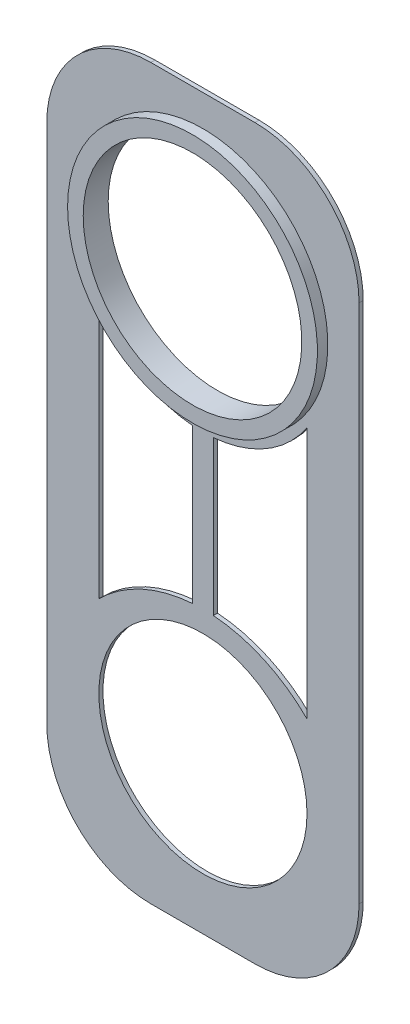
ISO-10303-21;
HEADER;
FILE_DESCRIPTION(('STEP AP214'),'2;1');
FILE_NAME('part.step','',(''),(''),'','','');
FILE_SCHEMA(('AUTOMOTIVE_DESIGN { 1 0 10303 214 1 1 1 1 }'));
ENDSEC;
DATA;
#1=APPLICATION_CONTEXT('core data for automotive mechanical design processes');
#2=APPLICATION_PROTOCOL_DEFINITION('international standard','automotive_design',2000,#1);
#3=PRODUCT_CONTEXT('',#1,'mechanical');
#4=PRODUCT('Part','Part','',(#3));
#5=PRODUCT_RELATED_PRODUCT_CATEGORY('part','',(#4));
#6=PRODUCT_DEFINITION_FORMATION('','',#4);
#7=PRODUCT_DEFINITION_CONTEXT('part definition',#1,'design');
#8=PRODUCT_DEFINITION('design','',#6,#7);
#9=PRODUCT_DEFINITION_SHAPE('','',#8);
#10=(LENGTH_UNIT() NAMED_UNIT(*) SI_UNIT(.MILLI.,.METRE.));
#11=(NAMED_UNIT(*) PLANE_ANGLE_UNIT() SI_UNIT($,.RADIAN.));
#12=(NAMED_UNIT(*) SI_UNIT($,.STERADIAN.) SOLID_ANGLE_UNIT());
#13=UNCERTAINTY_MEASURE_WITH_UNIT(LENGTH_MEASURE(1.E-05),#10,'distance_accuracy_value','');
#14=(GEOMETRIC_REPRESENTATION_CONTEXT(3) GLOBAL_UNCERTAINTY_ASSIGNED_CONTEXT((#13)) GLOBAL_UNIT_ASSIGNED_CONTEXT((#10,
#11,#12)) REPRESENTATION_CONTEXT('',''));
#15=CARTESIAN_POINT('',(0.,0.,0.));
#16=DIRECTION('',(0.,0.,1.));
#17=DIRECTION('',(1.,0.,0.));
#18=AXIS2_PLACEMENT_3D('',#15,#16,#17);
#19=CARTESIAN_POINT('',(19.05,16.3589354542511,1.778));
#20=DIRECTION('',(0.,0.,-1.));
#21=DIRECTION('',(-1.,0.,0.));
#22=AXIS2_PLACEMENT_3D('',#19,#20,#21);
#23=CYLINDRICAL_SURFACE('',#22,17.9605122421383);
#24=CARTESIAN_POINT('',(19.05,16.3589354542511,0.508));
#25=DIRECTION('',(0.,0.,1.));
#26=DIRECTION('',(1.,0.,0.));
#27=AXIS2_PLACEMENT_3D('',#24,#25,#26);
#28=CIRCLE('',#27,17.9605122421383);
#29=CARTESIAN_POINT('',(6.35,29.0589354542512,0.508));
#30=VERTEX_POINT('',#29);
#31=CARTESIAN_POINT('',(17.78,34.2744901484268,0.508));
#32=VERTEX_POINT('',#31);
#33=EDGE_CURVE('E224',#30,#32,#28,.F.);
#34=ORIENTED_EDGE('',*,*,#33,.T.);
#35=DIRECTION('',(0.,0.,-1.));
#36=VECTOR('',#35,1.);
#37=CARTESIAN_POINT('',(17.78,34.2744901484268,1.778));
#38=LINE('',#37,#36);
#39=CARTESIAN_POINT('',(17.78,34.2744901484268,0.));
#40=VERTEX_POINT('',#39);
#41=EDGE_CURVE('E162',#32,#40,#38,.T.);
#42=ORIENTED_EDGE('',*,*,#41,.T.);
#43=CARTESIAN_POINT('',(19.05,16.3589354542511,0.));
#44=DIRECTION('',(0.,0.,1.));
#45=DIRECTION('',(1.,0.,0.));
#46=AXIS2_PLACEMENT_3D('',#43,#44,#45);
#47=CIRCLE('',#46,17.9605122421383);
#48=CARTESIAN_POINT('',(6.35,29.0589354542512,0.));
#49=VERTEX_POINT('',#48);
#50=EDGE_CURVE('E181',#40,#49,#47,.T.);
#51=ORIENTED_EDGE('',*,*,#50,.T.);
#52=DIRECTION('',(0.,0.,-1.));
#53=VECTOR('',#52,1.);
#54=CARTESIAN_POINT('',(6.35,29.0589354542512,1.778));
#55=LINE('',#54,#53);
#56=EDGE_CURVE('E196',#30,#49,#55,.T.);
#57=ORIENTED_EDGE('',*,*,#56,.F.);
#58=EDGE_LOOP('',(#34,#42,#51,#57));
#59=FACE_BOUND('',#58,.T.);
#60=ADVANCED_FACE('F50',(#59),#23,.T.);
#61=CARTESIAN_POINT('',(19.05,68.2652915132516,1.778));
#62=DIRECTION('',(0.,0.,-1.));
#63=DIRECTION('',(-1.,0.,0.));
#64=AXIS2_PLACEMENT_3D('',#61,#62,#63);
#65=CYLINDRICAL_SURFACE('',#64,15.24);
#66=CARTESIAN_POINT('',(19.05,68.2652915132516,0.));
#67=DIRECTION('',(0.,0.,1.));
#68=DIRECTION('',(-1.,0.,0.));
#69=AXIS2_PLACEMENT_3D('',#66,#67,#68);
#70=CIRCLE('',#69,15.24);
#71=CARTESIAN_POINT('',(6.35000000000001,59.8410645457488,0.));
#72=VERTEX_POINT('',#71);
#73=CARTESIAN_POINT('',(17.78,53.0783003695128,0.));
#74=VERTEX_POINT('',#73);
#75=EDGE_CURVE('E193',#72,#74,#70,.T.);
#76=ORIENTED_EDGE('',*,*,#75,.T.);
#77=DIRECTION('',(0.,0.,-1.));
#78=VECTOR('',#77,1.);
#79=CARTESIAN_POINT('',(17.78,53.0783003695128,1.778));
#80=LINE('',#79,#78);
#81=CARTESIAN_POINT('',(17.78,53.0783003695128,0.508));
#82=VERTEX_POINT('',#81);
#83=EDGE_CURVE('E11',#74,#82,#80,.F.);
#84=ORIENTED_EDGE('',*,*,#83,.T.);
#85=CARTESIAN_POINT('',(19.05,68.2652915132516,0.508));
#86=DIRECTION('',(0.,0.,1.));
#87=DIRECTION('',(1.,0.,0.));
#88=AXIS2_PLACEMENT_3D('',#85,#86,#87);
#89=CIRCLE('',#88,15.24);
#90=CARTESIAN_POINT('',(6.35000000000001,59.8410645457488,0.508));
#91=VERTEX_POINT('',#90);
#92=EDGE_CURVE('E212',#82,#91,#89,.F.);
#93=ORIENTED_EDGE('',*,*,#92,.T.);
#94=DIRECTION('',(0.,0.,-1.));
#95=VECTOR('',#94,1.);
#96=CARTESIAN_POINT('',(6.35000000000001,59.8410645457488,1.778));
#97=LINE('',#96,#95);
#98=EDGE_CURVE('E206',#91,#72,#97,.T.);
#99=ORIENTED_EDGE('',*,*,#98,.T.);
#100=EDGE_LOOP('',(#76,#84,#93,#99));
#101=FACE_BOUND('',#100,.T.);
#102=ADVANCED_FACE('F361',(#101),#65,.T.);
#103=CARTESIAN_POINT('',(12.7,12.7,0.508));
#104=DIRECTION('',(0.,0.,1.));
#105=DIRECTION('',(1.,0.,0.));
#106=AXIS2_PLACEMENT_3D('',#103,#104,#105);
#107=PLANE('',#106);
#108=CARTESIAN_POINT('',(20.32,34.2744901484268,0.508));
#109=VERTEX_POINT('',#108);
#110=CARTESIAN_POINT('',(31.75,29.0589354542512,0.508));
#111=VERTEX_POINT('',#110);
#112=EDGE_CURVE('E225',#109,#111,#28,.F.);
#113=ORIENTED_EDGE('',*,*,#112,.F.);
#114=DIRECTION('',(0.,-1.,0.));
#115=VECTOR('',#114,1.);
#116=CARTESIAN_POINT('',(20.32,53.1718668378781,0.508));
#117=LINE('',#116,#115);
#118=CARTESIAN_POINT('',(20.32,53.0783003695128,0.508));
#119=VERTEX_POINT('',#118);
#120=EDGE_CURVE('E64',#119,#109,#117,.T.);
#121=ORIENTED_EDGE('',*,*,#120,.F.);
#122=CARTESIAN_POINT('',(31.75,59.8410645457488,0.508));
#123=VERTEX_POINT('',#122);
#124=EDGE_CURVE('E214',#123,#119,#89,.F.);
#125=ORIENTED_EDGE('',*,*,#124,.F.);
#126=DIRECTION('',(0.,1.,0.));
#127=VECTOR('',#126,1.);
#128=CARTESIAN_POINT('',(31.75,12.7,0.508));
#129=LINE('',#128,#127);
#130=EDGE_CURVE('E218',#111,#123,#129,.T.);
#131=ORIENTED_EDGE('',*,*,#130,.F.);
#132=EDGE_LOOP('',(#113,#121,#125,#131));
#133=FACE_BOUND('',#132,.T.);
#134=ORIENTED_EDGE('',*,*,#92,.F.);
#135=DIRECTION('',(0.,1.,0.));
#136=VECTOR('',#135,1.);
#137=CARTESIAN_POINT('',(17.78,34.1626918663108,0.508));
#138=LINE('',#137,#136);
#139=EDGE_CURVE('E163',#32,#82,#138,.T.);
#140=ORIENTED_EDGE('',*,*,#139,.F.);
#141=ORIENTED_EDGE('',*,*,#33,.F.);
#142=DIRECTION('',(0.,-1.,0.));
#143=VECTOR('',#142,1.);
#144=CARTESIAN_POINT('',(6.35,12.7,0.508));
#145=LINE('',#144,#143);
#146=EDGE_CURVE('E203',#91,#30,#145,.T.);
#147=ORIENTED_EDGE('',*,*,#146,.F.);
#148=EDGE_LOOP('',(#134,#140,#141,#147));
#149=FACE_BOUND('',#148,.T.);
#150=CARTESIAN_POINT('',(19.05,69.85,0.508));
#151=DIRECTION('',(0.,0.,-1.));
#152=DIRECTION('',(-1.,0.,0.));
#153=AXIS2_PLACEMENT_3D('',#150,#151,#152);
#154=CIRCLE('',#153,15.24);
#155=CARTESIAN_POINT('',(3.81000000000001,69.85,0.508));
#156=VERTEX_POINT('',#155);
#157=EDGE_CURVE('E233',#156,#156,#154,.T.);
#158=ORIENTED_EDGE('',*,*,#157,.T.);
#159=EDGE_LOOP('',(#158));
#160=FACE_BOUND('',#159,.T.);
#161=CARTESIAN_POINT('',(12.7,12.7,0.508));
#162=DIRECTION('',(0.,0.,1.));
#163=DIRECTION('',(1.,0.,0.));
#164=AXIS2_PLACEMENT_3D('',#161,#162,#163);
#165=CIRCLE('',#164,12.7);
#166=CARTESIAN_POINT('',(0.,12.7000000000001,0.508));
#167=VERTEX_POINT('',#166);
#168=CARTESIAN_POINT('',(12.7000000000001,0.,0.508));
#169=VERTEX_POINT('',#168);
#170=EDGE_CURVE('E261',#167,#169,#165,.T.);
#171=ORIENTED_EDGE('',*,*,#170,.T.);
#172=DIRECTION('',(1.,0.,0.));
#173=VECTOR('',#172,1.);
#174=CARTESIAN_POINT('',(12.7000000000001,0.,0.508));
#175=LINE('',#174,#173);
#176=CARTESIAN_POINT('',(25.3999999999999,0.,0.508));
#177=VERTEX_POINT('',#176);
#178=EDGE_CURVE('E264',#169,#177,#175,.T.);
#179=ORIENTED_EDGE('',*,*,#178,.T.);
#180=CARTESIAN_POINT('',(25.4,12.7,0.508));
#181=DIRECTION('',(0.,0.,1.));
#182=DIRECTION('',(1.,0.,0.));
#183=AXIS2_PLACEMENT_3D('',#180,#181,#182);
#184=CIRCLE('',#183,12.7);
#185=CARTESIAN_POINT('',(38.1,12.7000000000001,0.508));
#186=VERTEX_POINT('',#185);
#187=EDGE_CURVE('E267',#177,#186,#184,.T.);
#188=ORIENTED_EDGE('',*,*,#187,.T.);
#189=DIRECTION('',(0.,1.,0.));
#190=VECTOR('',#189,1.);
#191=CARTESIAN_POINT('',(38.1,12.7000000000001,0.508));
#192=LINE('',#191,#190);
#193=CARTESIAN_POINT('',(38.1,76.1999999999999,0.508));
#194=VERTEX_POINT('',#193);
#195=EDGE_CURVE('E275',#186,#194,#192,.T.);
#196=ORIENTED_EDGE('',*,*,#195,.T.);
#197=CARTESIAN_POINT('',(25.4,76.2,0.508));
#198=DIRECTION('',(0.,0.,1.));
#199=DIRECTION('',(1.,0.,0.));
#200=AXIS2_PLACEMENT_3D('',#197,#198,#199);
#201=CIRCLE('',#200,12.7);
#202=CARTESIAN_POINT('',(25.3999999999999,88.9,0.508));
#203=VERTEX_POINT('',#202);
#204=EDGE_CURVE('E274',#194,#203,#201,.T.);
#205=ORIENTED_EDGE('',*,*,#204,.T.);
#206=DIRECTION('',(-1.,0.,0.));
#207=VECTOR('',#206,1.);
#208=CARTESIAN_POINT('',(12.7000000000001,88.9,0.508));
#209=LINE('',#208,#207);
#210=CARTESIAN_POINT('',(12.7000000000001,88.9,0.508));
#211=VERTEX_POINT('',#210);
#212=EDGE_CURVE('E279',#203,#211,#209,.T.);
#213=ORIENTED_EDGE('',*,*,#212,.T.);
#214=CARTESIAN_POINT('',(12.7,76.2,0.508));
#215=DIRECTION('',(0.,0.,1.));
#216=DIRECTION('',(1.,0.,0.));
#217=AXIS2_PLACEMENT_3D('',#214,#215,#216);
#218=CIRCLE('',#217,12.7);
#219=CARTESIAN_POINT('',(0.,76.1999999999999,0.508));
#220=VERTEX_POINT('',#219);
#221=EDGE_CURVE('E282',#211,#220,#218,.T.);
#222=ORIENTED_EDGE('',*,*,#221,.T.);
#223=DIRECTION('',(0.,-1.,0.));
#224=VECTOR('',#223,1.);
#225=CARTESIAN_POINT('',(0.,12.7000000000001,0.508));
#226=LINE('',#225,#224);
#227=EDGE_CURVE('E281',#220,#167,#226,.T.);
#228=ORIENTED_EDGE('',*,*,#227,.T.);
#229=EDGE_LOOP('',(#171,#179,#188,#196,#205,#213,#222,#228));
#230=FACE_BOUND('',#229,.T.);
#231=CARTESIAN_POINT('',(19.05,19.05,0.508));
#232=DIRECTION('',(0.,0.,1.));
#233=DIRECTION('',(1.,0.,0.));
#234=AXIS2_PLACEMENT_3D('',#231,#232,#233);
#235=CIRCLE('',#234,12.7);
#236=CARTESIAN_POINT('',(31.75,19.05,0.508));
#237=VERTEX_POINT('',#236);
#238=EDGE_CURVE('E251',#237,#237,#235,.T.);
#239=ORIENTED_EDGE('',*,*,#238,.F.);
#240=EDGE_LOOP('',(#239));
#241=FACE_BOUND('',#240,.T.);
#242=ADVANCED_FACE('F347',(#133,#149,#160,#230,#241),#107,.T.);
#243=CARTESIAN_POINT('',(12.7,12.7,0.));
#244=DIRECTION('',(0.,0.,1.));
#245=DIRECTION('',(1.,0.,0.));
#246=AXIS2_PLACEMENT_3D('',#243,#244,#245);
#247=PLANE('',#246);
#248=ORIENTED_EDGE('',*,*,#50,.F.);
#249=DIRECTION('',(0.,1.,0.));
#250=VECTOR('',#249,1.);
#251=CARTESIAN_POINT('',(17.78,53.0252915132516,0.));
#252=LINE('',#251,#250);
#253=EDGE_CURVE('E173',#40,#74,#252,.T.);
#254=ORIENTED_EDGE('',*,*,#253,.T.);
#255=ORIENTED_EDGE('',*,*,#75,.F.);
#256=DIRECTION('',(0.,1.,0.));
#257=VECTOR('',#256,1.);
#258=CARTESIAN_POINT('',(6.35000000000001,59.8410645457488,0.));
#259=LINE('',#258,#257);
#260=EDGE_CURVE('E185',#49,#72,#259,.T.);
#261=ORIENTED_EDGE('',*,*,#260,.F.);
#262=EDGE_LOOP('',(#248,#254,#255,#261));
#263=FACE_BOUND('',#262,.T.);
#264=CARTESIAN_POINT('',(20.32,53.0783003695128,0.));
#265=VERTEX_POINT('',#264);
#266=CARTESIAN_POINT('',(31.75,59.8410645457488,0.));
#267=VERTEX_POINT('',#266);
#268=EDGE_CURVE('E174',#265,#267,#70,.T.);
#269=ORIENTED_EDGE('',*,*,#268,.F.);
#270=DIRECTION('',(0.,-1.,0.));
#271=VECTOR('',#270,1.);
#272=CARTESIAN_POINT('',(20.32,34.3194476963894,0.));
#273=LINE('',#272,#271);
#274=CARTESIAN_POINT('',(20.32,34.2744901484268,0.));
#275=VERTEX_POINT('',#274);
#276=EDGE_CURVE('E66',#265,#275,#273,.T.);
#277=ORIENTED_EDGE('',*,*,#276,.T.);
#278=CARTESIAN_POINT('',(31.75,29.0589354542512,0.));
#279=VERTEX_POINT('',#278);
#280=EDGE_CURVE('E175',#279,#275,#47,.T.);
#281=ORIENTED_EDGE('',*,*,#280,.F.);
#282=DIRECTION('',(0.,-1.,0.));
#283=VECTOR('',#282,1.);
#284=CARTESIAN_POINT('',(31.75,29.0589354542512,0.));
#285=LINE('',#284,#283);
#286=EDGE_CURVE('E194',#267,#279,#285,.T.);
#287=ORIENTED_EDGE('',*,*,#286,.F.);
#288=EDGE_LOOP('',(#269,#277,#281,#287));
#289=FACE_BOUND('',#288,.T.);
#290=CARTESIAN_POINT('',(19.05,69.85,0.));
#291=DIRECTION('',(0.,0.,-1.));
#292=DIRECTION('',(-1.,0.,0.));
#293=AXIS2_PLACEMENT_3D('',#290,#291,#292);
#294=CIRCLE('',#293,15.24);
#295=CARTESIAN_POINT('',(3.81000000000001,69.85,0.));
#296=VERTEX_POINT('',#295);
#297=EDGE_CURVE('E246',#296,#296,#294,.T.);
#298=ORIENTED_EDGE('',*,*,#297,.F.);
#299=EDGE_LOOP('',(#298));
#300=FACE_BOUND('',#299,.T.);
#301=CARTESIAN_POINT('',(12.7,12.7,0.));
#302=DIRECTION('',(0.,0.,1.));
#303=DIRECTION('',(1.,0.,0.));
#304=AXIS2_PLACEMENT_3D('',#301,#302,#303);
#305=CIRCLE('',#304,12.7);
#306=CARTESIAN_POINT('',(0.,12.7000000000001,0.));
#307=VERTEX_POINT('',#306);
#308=CARTESIAN_POINT('',(12.7000000000001,0.,0.));
#309=VERTEX_POINT('',#308);
#310=EDGE_CURVE('E260',#307,#309,#305,.T.);
#311=ORIENTED_EDGE('',*,*,#310,.F.);
#312=DIRECTION('',(0.,-1.,0.));
#313=VECTOR('',#312,1.);
#314=CARTESIAN_POINT('',(0.,12.7000000000001,0.));
#315=LINE('',#314,#313);
#316=CARTESIAN_POINT('',(0.,76.1999999999999,0.));
#317=VERTEX_POINT('',#316);
#318=EDGE_CURVE('E266',#317,#307,#315,.T.);
#319=ORIENTED_EDGE('',*,*,#318,.F.);
#320=CARTESIAN_POINT('',(12.7,76.2,0.));
#321=DIRECTION('',(0.,0.,1.));
#322=DIRECTION('',(1.,0.,0.));
#323=AXIS2_PLACEMENT_3D('',#320,#321,#322);
#324=CIRCLE('',#323,12.7);
#325=CARTESIAN_POINT('',(12.7000000000001,88.9,0.));
#326=VERTEX_POINT('',#325);
#327=EDGE_CURVE('E308',#326,#317,#324,.T.);
#328=ORIENTED_EDGE('',*,*,#327,.F.);
#329=DIRECTION('',(-1.,0.,0.));
#330=VECTOR('',#329,1.);
#331=CARTESIAN_POINT('',(12.7000000000001,88.9,0.));
#332=LINE('',#331,#330);
#333=CARTESIAN_POINT('',(25.3999999999999,88.9,0.));
#334=VERTEX_POINT('',#333);
#335=EDGE_CURVE('E301',#334,#326,#332,.T.);
#336=ORIENTED_EDGE('',*,*,#335,.F.);
#337=CARTESIAN_POINT('',(25.4,76.2,0.));
#338=DIRECTION('',(0.,0.,1.));
#339=DIRECTION('',(1.,0.,0.));
#340=AXIS2_PLACEMENT_3D('',#337,#338,#339);
#341=CIRCLE('',#340,12.7);
#342=CARTESIAN_POINT('',(38.1,76.1999999999999,0.));
#343=VERTEX_POINT('',#342);
#344=EDGE_CURVE('E298',#343,#334,#341,.T.);
#345=ORIENTED_EDGE('',*,*,#344,.F.);
#346=DIRECTION('',(0.,1.,0.));
#347=VECTOR('',#346,1.);
#348=CARTESIAN_POINT('',(38.1,12.7000000000001,0.));
#349=LINE('',#348,#347);
#350=CARTESIAN_POINT('',(38.1,12.7000000000001,0.));
#351=VERTEX_POINT('',#350);
#352=EDGE_CURVE('E300',#351,#343,#349,.T.);
#353=ORIENTED_EDGE('',*,*,#352,.F.);
#354=CARTESIAN_POINT('',(25.4,12.7,0.));
#355=DIRECTION('',(0.,0.,1.));
#356=DIRECTION('',(1.,0.,0.));
#357=AXIS2_PLACEMENT_3D('',#354,#355,#356);
#358=CIRCLE('',#357,12.7);
#359=CARTESIAN_POINT('',(25.3999999999999,0.,0.));
#360=VERTEX_POINT('',#359);
#361=EDGE_CURVE('E294',#360,#351,#358,.T.);
#362=ORIENTED_EDGE('',*,*,#361,.F.);
#363=DIRECTION('',(1.,0.,0.));
#364=VECTOR('',#363,1.);
#365=CARTESIAN_POINT('',(12.7000000000001,0.,0.));
#366=LINE('',#365,#364);
#367=EDGE_CURVE('E292',#309,#360,#366,.T.);
#368=ORIENTED_EDGE('',*,*,#367,.F.);
#369=EDGE_LOOP('',(#311,#319,#328,#336,#345,#353,#362,#368));
#370=FACE_BOUND('',#369,.T.);
#371=CARTESIAN_POINT('',(19.05,19.05,0.));
#372=DIRECTION('',(0.,0.,1.));
#373=DIRECTION('',(1.,0.,0.));
#374=AXIS2_PLACEMENT_3D('',#371,#372,#373);
#375=CIRCLE('',#374,12.7);
#376=CARTESIAN_POINT('',(31.75,19.05,0.));
#377=VERTEX_POINT('',#376);
#378=EDGE_CURVE('E250',#377,#377,#375,.T.);
#379=ORIENTED_EDGE('',*,*,#378,.T.);
#380=EDGE_LOOP('',(#379));
#381=FACE_BOUND('',#380,.T.);
#382=ADVANCED_FACE('F166',(#263,#289,#300,#370,#381),#247,.F.);
#383=CARTESIAN_POINT('',(12.7,12.7,0.508));
#384=DIRECTION('',(0.,0.,-1.));
#385=DIRECTION('',(-1.,0.,0.));
#386=AXIS2_PLACEMENT_3D('',#383,#384,#385);
#387=CYLINDRICAL_SURFACE('',#386,12.7);
#388=ORIENTED_EDGE('',*,*,#310,.T.);
#389=DIRECTION('',(0.,0.,-1.));
#390=VECTOR('',#389,1.);
#391=CARTESIAN_POINT('',(12.7000000000001,0.,0.508));
#392=LINE('',#391,#390);
#393=EDGE_CURVE('E252',#169,#309,#392,.T.);
#394=ORIENTED_EDGE('',*,*,#393,.F.);
#395=ORIENTED_EDGE('',*,*,#170,.F.);
#396=DIRECTION('',(0.,0.,-1.));
#397=VECTOR('',#396,1.);
#398=CARTESIAN_POINT('',(0.,12.7000000000001,0.508));
#399=LINE('',#398,#397);
#400=EDGE_CURVE('E290',#167,#307,#399,.T.);
#401=ORIENTED_EDGE('',*,*,#400,.T.);
#402=EDGE_LOOP('',(#388,#394,#395,#401));
#403=FACE_BOUND('',#402,.T.);
#404=ADVANCED_FACE('F47',(#403),#387,.T.);
#405=CARTESIAN_POINT('',(12.7000000000001,0.,0.508));
#406=DIRECTION('',(0.,1.,0.));
#407=DIRECTION('',(0.,0.,1.));
#408=AXIS2_PLACEMENT_3D('',#405,#406,#407);
#409=PLANE('',#408);
#410=ORIENTED_EDGE('',*,*,#367,.T.);
#411=DIRECTION('',(0.,0.,-1.));
#412=VECTOR('',#411,1.);
#413=CARTESIAN_POINT('',(25.3999999999999,0.,0.508));
#414=LINE('',#413,#412);
#415=EDGE_CURVE('E331',#177,#360,#414,.T.);
#416=ORIENTED_EDGE('',*,*,#415,.F.);
#417=ORIENTED_EDGE('',*,*,#178,.F.);
#418=ORIENTED_EDGE('',*,*,#393,.T.);
#419=EDGE_LOOP('',(#410,#416,#417,#418));
#420=FACE_BOUND('',#419,.T.);
#421=ADVANCED_FACE('F455',(#420),#409,.F.);
#422=CARTESIAN_POINT('',(25.4,12.7,0.508));
#423=DIRECTION('',(0.,0.,-1.));
#424=DIRECTION('',(-1.,0.,0.));
#425=AXIS2_PLACEMENT_3D('',#422,#423,#424);
#426=CYLINDRICAL_SURFACE('',#425,12.7);
#427=ORIENTED_EDGE('',*,*,#361,.T.);
#428=DIRECTION('',(0.,0.,-1.));
#429=VECTOR('',#428,1.);
#430=CARTESIAN_POINT('',(38.1,12.7000000000001,0.508));
#431=LINE('',#430,#429);
#432=EDGE_CURVE('E329',#186,#351,#431,.T.);
#433=ORIENTED_EDGE('',*,*,#432,.F.);
#434=ORIENTED_EDGE('',*,*,#187,.F.);
#435=ORIENTED_EDGE('',*,*,#415,.T.);
#436=EDGE_LOOP('',(#427,#433,#434,#435));
#437=FACE_BOUND('',#436,.T.);
#438=ADVANCED_FACE('F446',(#437),#426,.T.);
#439=CARTESIAN_POINT('',(38.1,12.7000000000001,0.508));
#440=DIRECTION('',(-1.,0.,0.));
#441=DIRECTION('',(0.,0.,1.));
#442=AXIS2_PLACEMENT_3D('',#439,#440,#441);
#443=PLANE('',#442);
#444=ORIENTED_EDGE('',*,*,#352,.T.);
#445=DIRECTION('',(0.,0.,-1.));
#446=VECTOR('',#445,1.);
#447=CARTESIAN_POINT('',(38.1,76.1999999999999,0.508));
#448=LINE('',#447,#446);
#449=EDGE_CURVE('E326',#194,#343,#448,.T.);
#450=ORIENTED_EDGE('',*,*,#449,.F.);
#451=ORIENTED_EDGE('',*,*,#195,.F.);
#452=ORIENTED_EDGE('',*,*,#432,.T.);
#453=EDGE_LOOP('',(#444,#450,#451,#452));
#454=FACE_BOUND('',#453,.T.);
#455=ADVANCED_FACE('F443',(#454),#443,.F.);
#456=CARTESIAN_POINT('',(25.4,76.2,0.508));
#457=DIRECTION('',(0.,0.,-1.));
#458=DIRECTION('',(-1.,0.,0.));
#459=AXIS2_PLACEMENT_3D('',#456,#457,#458);
#460=CYLINDRICAL_SURFACE('',#459,12.7);
#461=ORIENTED_EDGE('',*,*,#344,.T.);
#462=DIRECTION('',(0.,0.,-1.));
#463=VECTOR('',#462,1.);
#464=CARTESIAN_POINT('',(25.3999999999999,88.9,0.508));
#465=LINE('',#464,#463);
#466=EDGE_CURVE('E325',#203,#334,#465,.T.);
#467=ORIENTED_EDGE('',*,*,#466,.F.);
#468=ORIENTED_EDGE('',*,*,#204,.F.);
#469=ORIENTED_EDGE('',*,*,#449,.T.);
#470=EDGE_LOOP('',(#461,#467,#468,#469));
#471=FACE_BOUND('',#470,.T.);
#472=ADVANCED_FACE('F442',(#471),#460,.T.);
#473=CARTESIAN_POINT('',(12.7000000000001,88.9,0.508));
#474=DIRECTION('',(0.,-1.,0.));
#475=DIRECTION('',(0.,0.,-1.));
#476=AXIS2_PLACEMENT_3D('',#473,#474,#475);
#477=PLANE('',#476);
#478=ORIENTED_EDGE('',*,*,#335,.T.);
#479=DIRECTION('',(0.,0.,-1.));
#480=VECTOR('',#479,1.);
#481=CARTESIAN_POINT('',(12.7000000000001,88.9,0.508));
#482=LINE('',#481,#480);
#483=EDGE_CURVE('E318',#211,#326,#482,.T.);
#484=ORIENTED_EDGE('',*,*,#483,.F.);
#485=ORIENTED_EDGE('',*,*,#212,.F.);
#486=ORIENTED_EDGE('',*,*,#466,.T.);
#487=EDGE_LOOP('',(#478,#484,#485,#486));
#488=FACE_BOUND('',#487,.T.);
#489=ADVANCED_FACE('F440',(#488),#477,.F.);
#490=CARTESIAN_POINT('',(12.7,76.2,0.508));
#491=DIRECTION('',(0.,0.,-1.));
#492=DIRECTION('',(-1.,0.,0.));
#493=AXIS2_PLACEMENT_3D('',#490,#491,#492);
#494=CYLINDRICAL_SURFACE('',#493,12.7);
#495=ORIENTED_EDGE('',*,*,#327,.T.);
#496=DIRECTION('',(0.,0.,-1.));
#497=VECTOR('',#496,1.);
#498=CARTESIAN_POINT('',(0.,76.1999999999999,0.508));
#499=LINE('',#498,#497);
#500=EDGE_CURVE('E314',#220,#317,#499,.T.);
#501=ORIENTED_EDGE('',*,*,#500,.F.);
#502=ORIENTED_EDGE('',*,*,#221,.F.);
#503=ORIENTED_EDGE('',*,*,#483,.T.);
#504=EDGE_LOOP('',(#495,#501,#502,#503));
#505=FACE_BOUND('',#504,.T.);
#506=ADVANCED_FACE('F433',(#505),#494,.T.);
#507=CARTESIAN_POINT('',(0.,12.7000000000001,0.508));
#508=DIRECTION('',(1.,0.,0.));
#509=DIRECTION('',(0.,0.,-1.));
#510=AXIS2_PLACEMENT_3D('',#507,#508,#509);
#511=PLANE('',#510);
#512=ORIENTED_EDGE('',*,*,#318,.T.);
#513=ORIENTED_EDGE('',*,*,#400,.F.);
#514=ORIENTED_EDGE('',*,*,#227,.F.);
#515=ORIENTED_EDGE('',*,*,#500,.T.);
#516=EDGE_LOOP('',(#512,#513,#514,#515));
#517=FACE_BOUND('',#516,.T.);
#518=ADVANCED_FACE('F426',(#517),#511,.F.);
#519=CARTESIAN_POINT('',(19.05,69.85,0.508));
#520=DIRECTION('',(0.,0.,-1.));
#521=DIRECTION('',(-1.,0.,0.));
#522=AXIS2_PLACEMENT_3D('',#519,#520,#521);
#523=CYLINDRICAL_SURFACE('',#522,13.335);
#524=CARTESIAN_POINT('',(19.05,69.85,-1.27));
#525=DIRECTION('',(0.,0.,-1.));
#526=DIRECTION('',(-1.,0.,0.));
#527=AXIS2_PLACEMENT_3D('',#524,#525,#526);
#528=CIRCLE('',#527,13.335);
#529=CARTESIAN_POINT('',(5.715,69.85,-1.27));
#530=VERTEX_POINT('',#529);
#531=EDGE_CURVE('E237',#530,#530,#528,.T.);
#532=ORIENTED_EDGE('',*,*,#531,.T.);
#533=EDGE_LOOP('',(#532));
#534=FACE_BOUND('',#533,.T.);
#535=CARTESIAN_POINT('',(19.05,69.85,1.778));
#536=DIRECTION('',(0.,0.,-1.));
#537=DIRECTION('',(-1.,0.,0.));
#538=AXIS2_PLACEMENT_3D('',#535,#536,#537);
#539=CIRCLE('',#538,13.335);
#540=CARTESIAN_POINT('',(5.715,69.85,1.778));
#541=VERTEX_POINT('',#540);
#542=EDGE_CURVE('E230',#541,#541,#539,.T.);
#543=ORIENTED_EDGE('',*,*,#542,.F.);
#544=EDGE_LOOP('',(#543));
#545=FACE_BOUND('',#544,.T.);
#546=ADVANCED_FACE('F425',(#534,#545),#523,.F.);
#547=CARTESIAN_POINT('',(19.05,19.05,0.508));
#548=DIRECTION('',(0.,0.,-1.));
#549=DIRECTION('',(-1.,0.,0.));
#550=AXIS2_PLACEMENT_3D('',#547,#548,#549);
#551=CYLINDRICAL_SURFACE('',#550,12.7);
#552=ORIENTED_EDGE('',*,*,#238,.T.);
#553=EDGE_LOOP('',(#552));
#554=FACE_BOUND('',#553,.T.);
#555=ORIENTED_EDGE('',*,*,#378,.F.);
#556=EDGE_LOOP('',(#555));
#557=FACE_BOUND('',#556,.T.);
#558=ADVANCED_FACE('F414',(#554,#557),#551,.F.);
#559=CARTESIAN_POINT('',(19.05,69.85,-1.27));
#560=DIRECTION('',(0.,0.,-1.));
#561=DIRECTION('',(-1.,0.,0.));
#562=AXIS2_PLACEMENT_3D('',#559,#560,#561);
#563=PLANE('',#562);
#564=CARTESIAN_POINT('',(19.05,69.85,-1.27));
#565=DIRECTION('',(0.,0.,-1.));
#566=DIRECTION('',(-1.,0.,0.));
#567=AXIS2_PLACEMENT_3D('',#564,#565,#566);
#568=CIRCLE('',#567,15.24);
#569=CARTESIAN_POINT('',(3.81000000000001,69.85,-1.27));
#570=VERTEX_POINT('',#569);
#571=EDGE_CURVE('E244',#570,#570,#568,.T.);
#572=ORIENTED_EDGE('',*,*,#571,.T.);
#573=EDGE_LOOP('',(#572));
#574=FACE_BOUND('',#573,.T.);
#575=ORIENTED_EDGE('',*,*,#531,.F.);
#576=EDGE_LOOP('',(#575));
#577=FACE_BOUND('',#576,.T.);
#578=ADVANCED_FACE('F415',(#574,#577),#563,.T.);
#579=CARTESIAN_POINT('',(19.05,69.85,-1.27));
#580=DIRECTION('',(0.,0.,1.));
#581=DIRECTION('',(1.,0.,0.));
#582=AXIS2_PLACEMENT_3D('',#579,#580,#581);
#583=CYLINDRICAL_SURFACE('',#582,15.24);
#584=ORIENTED_EDGE('',*,*,#571,.F.);
#585=EDGE_LOOP('',(#584));
#586=FACE_BOUND('',#585,.T.);
#587=ORIENTED_EDGE('',*,*,#297,.T.);
#588=EDGE_LOOP('',(#587));
#589=FACE_BOUND('',#588,.T.);
#590=ADVANCED_FACE('F410',(#586,#589),#583,.T.);
#591=CARTESIAN_POINT('',(19.05,69.85,1.778));
#592=DIRECTION('',(0.,0.,-1.));
#593=DIRECTION('',(-1.,0.,0.));
#594=AXIS2_PLACEMENT_3D('',#591,#592,#593);
#595=CYLINDRICAL_SURFACE('',#594,15.24);
#596=CARTESIAN_POINT('',(19.05,69.85,1.778));
#597=DIRECTION('',(0.,0.,-1.));
#598=DIRECTION('',(-1.,0.,0.));
#599=AXIS2_PLACEMENT_3D('',#596,#597,#598);
#600=CIRCLE('',#599,15.24);
#601=CARTESIAN_POINT('',(3.81000000000001,69.85,1.778));
#602=VERTEX_POINT('',#601);
#603=EDGE_CURVE('E235',#602,#602,#600,.T.);
#604=ORIENTED_EDGE('',*,*,#603,.T.);
#605=EDGE_LOOP('',(#604));
#606=FACE_BOUND('',#605,.T.);
#607=ORIENTED_EDGE('',*,*,#157,.F.);
#608=EDGE_LOOP('',(#607));
#609=FACE_BOUND('',#608,.T.);
#610=ADVANCED_FACE('F405',(#606,#609),#595,.T.);
#611=CARTESIAN_POINT('',(19.05,69.85,1.778));
#612=DIRECTION('',(0.,0.,1.));
#613=DIRECTION('',(-1.,0.,0.));
#614=AXIS2_PLACEMENT_3D('',#611,#612,#613);
#615=PLANE('',#614);
#616=ORIENTED_EDGE('',*,*,#542,.T.);
#617=EDGE_LOOP('',(#616));
#618=FACE_BOUND('',#617,.T.);
#619=ORIENTED_EDGE('',*,*,#603,.F.);
#620=EDGE_LOOP('',(#619));
#621=FACE_BOUND('',#620,.T.);
#622=ADVANCED_FACE('F391',(#618,#621),#615,.T.);
#623=ORIENTED_EDGE('',*,*,#280,.T.);
#624=DIRECTION('',(0.,0.,-1.));
#625=VECTOR('',#624,1.);
#626=CARTESIAN_POINT('',(20.32,34.2744901484268,1.778));
#627=LINE('',#626,#625);
#628=EDGE_CURVE('E160',#275,#109,#627,.F.);
#629=ORIENTED_EDGE('',*,*,#628,.T.);
#630=ORIENTED_EDGE('',*,*,#112,.T.);
#631=DIRECTION('',(0.,0.,-1.));
#632=VECTOR('',#631,1.);
#633=CARTESIAN_POINT('',(31.75,29.0589354542512,1.778));
#634=LINE('',#633,#632);
#635=EDGE_CURVE('E177',#111,#279,#634,.T.);
#636=ORIENTED_EDGE('',*,*,#635,.T.);
#637=EDGE_LOOP('',(#623,#629,#630,#636));
#638=FACE_BOUND('',#637,.T.);
#639=ADVANCED_FACE('F180',(#638),#23,.T.);
#640=CARTESIAN_POINT('',(31.75,29.0589354542512,1.778));
#641=DIRECTION('',(1.,0.,0.));
#642=DIRECTION('',(0.,1.,0.));
#643=AXIS2_PLACEMENT_3D('',#640,#641,#642);
#644=PLANE('',#643);
#645=ORIENTED_EDGE('',*,*,#130,.T.);
#646=DIRECTION('',(0.,0.,-1.));
#647=VECTOR('',#646,1.);
#648=CARTESIAN_POINT('',(31.75,59.8410645457488,1.778));
#649=LINE('',#648,#647);
#650=EDGE_CURVE('E205',#123,#267,#649,.T.);
#651=ORIENTED_EDGE('',*,*,#650,.T.);
#652=ORIENTED_EDGE('',*,*,#286,.T.);
#653=ORIENTED_EDGE('',*,*,#635,.F.);
#654=EDGE_LOOP('',(#645,#651,#652,#653));
#655=FACE_BOUND('',#654,.T.);
#656=ADVANCED_FACE('F394',(#655),#644,.F.);
#657=ORIENTED_EDGE('',*,*,#124,.T.);
#658=DIRECTION('',(0.,0.,-1.));
#659=VECTOR('',#658,1.);
#660=CARTESIAN_POINT('',(20.32,53.0783003695128,1.778));
#661=LINE('',#660,#659);
#662=EDGE_CURVE('E57',#119,#265,#661,.T.);
#663=ORIENTED_EDGE('',*,*,#662,.T.);
#664=ORIENTED_EDGE('',*,*,#268,.T.);
#665=ORIENTED_EDGE('',*,*,#650,.F.);
#666=EDGE_LOOP('',(#657,#663,#664,#665));
#667=FACE_BOUND('',#666,.T.);
#668=ADVANCED_FACE('F345',(#667),#65,.T.);
#669=CARTESIAN_POINT('',(6.35000000000001,59.8410645457488,1.778));
#670=DIRECTION('',(-1.,0.,0.));
#671=DIRECTION('',(0.,-1.,0.));
#672=AXIS2_PLACEMENT_3D('',#669,#670,#671);
#673=PLANE('',#672);
#674=ORIENTED_EDGE('',*,*,#146,.T.);
#675=ORIENTED_EDGE('',*,*,#56,.T.);
#676=ORIENTED_EDGE('',*,*,#260,.T.);
#677=ORIENTED_EDGE('',*,*,#98,.F.);
#678=EDGE_LOOP('',(#674,#675,#676,#677));
#679=FACE_BOUND('',#678,.T.);
#680=ADVANCED_FACE('F366',(#679),#673,.F.);
#681=CARTESIAN_POINT('',(17.78,53.0252915132516,0.508));
#682=DIRECTION('',(-1.,0.,0.));
#683=DIRECTION('',(0.,0.,1.));
#684=AXIS2_PLACEMENT_3D('',#681,#682,#683);
#685=PLANE('',#684);
#686=ORIENTED_EDGE('',*,*,#41,.F.);
#687=ORIENTED_EDGE('',*,*,#139,.T.);
#688=ORIENTED_EDGE('',*,*,#83,.F.);
#689=ORIENTED_EDGE('',*,*,#253,.F.);
#690=EDGE_LOOP('',(#686,#687,#688,#689));
#691=FACE_BOUND('',#690,.T.);
#692=ADVANCED_FACE('F372',(#691),#685,.T.);
#693=CARTESIAN_POINT('',(20.32,34.3194476963894,0.508));
#694=DIRECTION('',(1.,0.,0.));
#695=DIRECTION('',(0.,0.,-1.));
#696=AXIS2_PLACEMENT_3D('',#693,#694,#695);
#697=PLANE('',#696);
#698=ORIENTED_EDGE('',*,*,#628,.F.);
#699=ORIENTED_EDGE('',*,*,#276,.F.);
#700=ORIENTED_EDGE('',*,*,#662,.F.);
#701=ORIENTED_EDGE('',*,*,#120,.T.);
#702=EDGE_LOOP('',(#698,#699,#700,#701));
#703=FACE_BOUND('',#702,.T.);
#704=ADVANCED_FACE('F158',(#703),#697,.T.);
#705=CLOSED_SHELL('',(#60,#102,#242,#382,#404,#421,#438,#455,#472,#489,#506,#518,#546,#558,#578,
#590,#610,#622,#639,#656,#668,#680,#692,#704));
#706=MANIFOLD_SOLID_BREP('B2',#705);
#707=ADVANCED_BREP_SHAPE_REPRESENTATION('',(#18,#706),#14);
#708=SHAPE_DEFINITION_REPRESENTATION(#9,#707);
ENDSEC;
END-ISO-10303-21;
